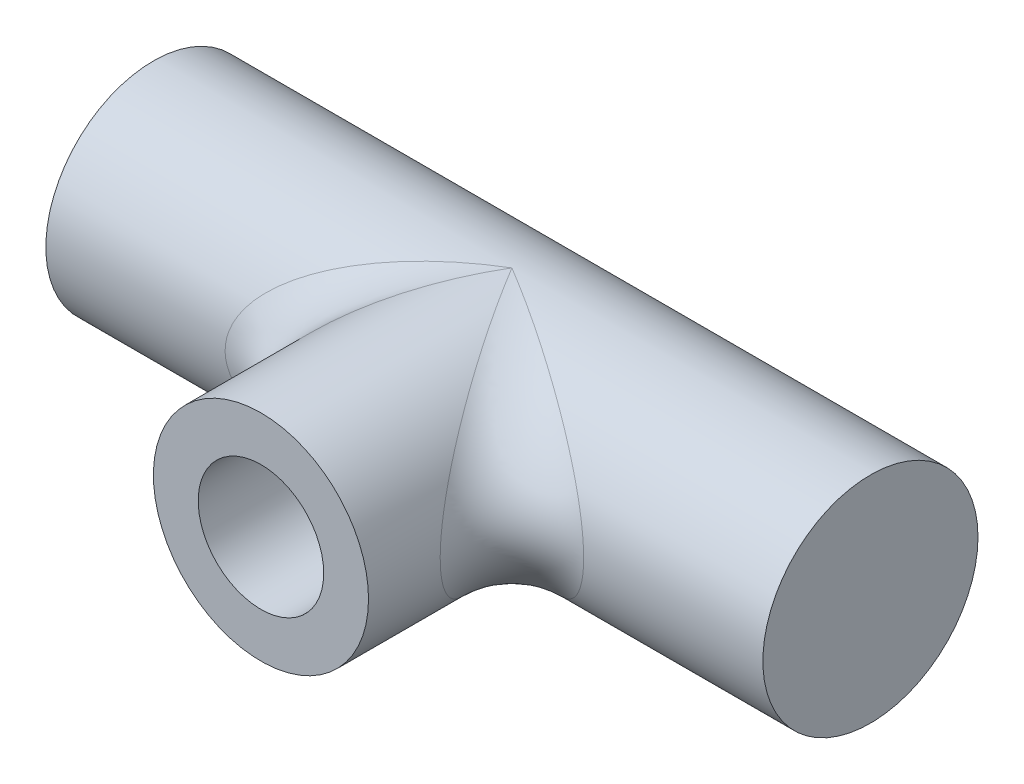
ISO-10303-21;
HEADER;
FILE_DESCRIPTION(('STEP AP214'),'2;1');
FILE_NAME('part.step','',(''),(''),'','','');
FILE_SCHEMA(('AUTOMOTIVE_DESIGN { 1 0 10303 214 1 1 1 1 }'));
ENDSEC;
DATA;
#1=APPLICATION_CONTEXT('core data for automotive mechanical design processes');
#2=APPLICATION_PROTOCOL_DEFINITION('international standard','automotive_design',2000,#1);
#3=PRODUCT_CONTEXT('',#1,'mechanical');
#4=PRODUCT('Part','Part','',(#3));
#5=PRODUCT_RELATED_PRODUCT_CATEGORY('part','',(#4));
#6=PRODUCT_DEFINITION_FORMATION('','',#4);
#7=PRODUCT_DEFINITION_CONTEXT('part definition',#1,'design');
#8=PRODUCT_DEFINITION('design','',#6,#7);
#9=PRODUCT_DEFINITION_SHAPE('','',#8);
#10=(LENGTH_UNIT() NAMED_UNIT(*) SI_UNIT(.MILLI.,.METRE.));
#11=(NAMED_UNIT(*) PLANE_ANGLE_UNIT() SI_UNIT($,.RADIAN.));
#12=(NAMED_UNIT(*) SI_UNIT($,.STERADIAN.) SOLID_ANGLE_UNIT());
#13=UNCERTAINTY_MEASURE_WITH_UNIT(LENGTH_MEASURE(1.E-05),#10,'distance_accuracy_value','');
#14=(GEOMETRIC_REPRESENTATION_CONTEXT(3) GLOBAL_UNCERTAINTY_ASSIGNED_CONTEXT((#13)) GLOBAL_UNIT_ASSIGNED_CONTEXT((#10,
#11,#12)) REPRESENTATION_CONTEXT('',''));
#15=CARTESIAN_POINT('',(0.,0.,0.));
#16=DIRECTION('',(0.,0.,1.));
#17=DIRECTION('',(1.,0.,0.));
#18=AXIS2_PLACEMENT_3D('',#15,#16,#17);
#19=CARTESIAN_POINT('',(25.4,0.,0.));
#20=DIRECTION('',(-1.,0.,0.));
#21=DIRECTION('',(0.,0.,1.));
#22=AXIS2_PLACEMENT_3D('',#19,#20,#21);
#23=CYLINDRICAL_SURFACE('',#22,3.81);
#24=CARTESIAN_POINT('',(0.,0.,0.));
#25=DIRECTION('',(1.,0.,0.));
#26=DIRECTION('',(0.,0.,-1.));
#27=AXIS2_PLACEMENT_3D('',#24,#25,#26);
#28=CIRCLE('',#27,3.81);
#29=CARTESIAN_POINT('',(0.,0.,-3.81));
#30=VERTEX_POINT('',#29);
#31=EDGE_CURVE('E99',#30,#30,#28,.T.);
#32=ORIENTED_EDGE('',*,*,#31,.T.);
#33=EDGE_LOOP('',(#32));
#34=FACE_BOUND('',#33,.T.);
#35=CARTESIAN_POINT('',(25.4,0.,0.));
#36=DIRECTION('',(1.,0.,0.));
#37=DIRECTION('',(0.,0.,-1.));
#38=AXIS2_PLACEMENT_3D('',#35,#36,#37);
#39=CIRCLE('',#38,3.81);
#40=CARTESIAN_POINT('',(25.4,0.,-3.81));
#41=VERTEX_POINT('',#40);
#42=EDGE_CURVE('E64',#41,#41,#39,.T.);
#43=ORIENTED_EDGE('',*,*,#42,.F.);
#44=EDGE_LOOP('',(#43));
#45=FACE_BOUND('',#44,.T.);
#46=CARTESIAN_POINT('',(12.7,0.,0.));
#47=DIRECTION('',(-0.514495755427526,0.,0.857492925712544));
#48=DIRECTION('',(-0.857492925712544,0.,-0.514495755427527));
#49=AXIS2_PLACEMENT_3D('',#46,#47,#48);
#50=ELLIPSE('',#49,7.40530890645353,3.81);
#51=CARTESIAN_POINT('',(12.7,3.81,0.));
#52=VERTEX_POINT('',#51);
#53=CARTESIAN_POINT('',(12.7,-3.81,0.));
#54=VERTEX_POINT('',#53);
#55=EDGE_CURVE('E46',#52,#54,#50,.F.);
#56=ORIENTED_EDGE('',*,*,#55,.T.);
#57=CARTESIAN_POINT('',(12.7,0.,0.));
#58=DIRECTION('',(0.514495755427526,0.,0.857492925712544));
#59=DIRECTION('',(0.857492925712544,0.,-0.514495755427527));
#60=AXIS2_PLACEMENT_3D('',#57,#58,#59);
#61=ELLIPSE('',#60,7.40530890645353,3.81);
#62=EDGE_CURVE('E11',#54,#52,#61,.F.);
#63=ORIENTED_EDGE('',*,*,#62,.T.);
#64=EDGE_LOOP('',(#56,#63));
#65=FACE_BOUND('',#64,.T.);
#66=ADVANCED_FACE('F33',(#34,#45,#65),#23,.T.);
#67=CARTESIAN_POINT('',(25.4,0.,0.));
#68=DIRECTION('',(1.,0.,0.));
#69=DIRECTION('',(0.,0.,-1.));
#70=AXIS2_PLACEMENT_3D('',#67,#68,#69);
#71=PLANE('',#70);
#72=ORIENTED_EDGE('',*,*,#42,.T.);
#73=EDGE_LOOP('',(#72));
#74=FACE_BOUND('',#73,.T.);
#75=ADVANCED_FACE('F84',(#74),#71,.T.);
#76=CARTESIAN_POINT('',(0.,0.,0.));
#77=DIRECTION('',(1.,0.,0.));
#78=DIRECTION('',(0.,0.,-1.));
#79=AXIS2_PLACEMENT_3D('',#76,#77,#78);
#80=PLANE('',#79);
#81=ORIENTED_EDGE('',*,*,#31,.F.);
#82=EDGE_LOOP('',(#81));
#83=FACE_BOUND('',#82,.T.);
#84=ADVANCED_FACE('F81',(#83),#80,.F.);
#85=CARTESIAN_POINT('',(12.7,0.,8.89));
#86=DIRECTION('',(0.,0.,-1.));
#87=DIRECTION('',(-1.,0.,0.));
#88=AXIS2_PLACEMENT_3D('',#85,#86,#87);
#89=CYLINDRICAL_SURFACE('',#88,3.81);
#90=CARTESIAN_POINT('',(12.7,0.,8.89));
#91=DIRECTION('',(0.,0.,1.));
#92=DIRECTION('',(1.,0.,0.));
#93=AXIS2_PLACEMENT_3D('',#90,#91,#92);
#94=CIRCLE('',#93,3.81);
#95=CARTESIAN_POINT('',(16.51,0.,8.89));
#96=VERTEX_POINT('',#95);
#97=EDGE_CURVE('E103',#96,#96,#94,.T.);
#98=ORIENTED_EDGE('',*,*,#97,.F.);
#99=EDGE_LOOP('',(#98));
#100=FACE_BOUND('',#99,.T.);
#101=CARTESIAN_POINT('',(12.7,0.,0.));
#102=DIRECTION('',(-0.857492925712544,0.,0.514495755427527));
#103=DIRECTION('',(-0.514495755427527,0.,-0.857492925712544));
#104=AXIS2_PLACEMENT_3D('',#101,#102,#103);
#105=ELLIPSE('',#104,7.40530890645353,3.81);
#106=EDGE_CURVE('E57',#54,#52,#105,.T.);
#107=ORIENTED_EDGE('',*,*,#106,.T.);
#108=CARTESIAN_POINT('',(12.7,0.,0.));
#109=DIRECTION('',(0.857492925712544,0.,0.514495755427527));
#110=DIRECTION('',(0.514495755427527,0.,-0.857492925712544));
#111=AXIS2_PLACEMENT_3D('',#108,#109,#110);
#112=ELLIPSE('',#111,7.40530890645353,3.81);
#113=EDGE_CURVE('E60',#52,#54,#112,.T.);
#114=ORIENTED_EDGE('',*,*,#113,.T.);
#115=EDGE_LOOP('',(#107,#114));
#116=FACE_BOUND('',#115,.T.);
#117=ADVANCED_FACE('F63',(#100,#116),#89,.T.);
#118=CARTESIAN_POINT('',(12.7,0.,8.89));
#119=DIRECTION('',(0.,0.,1.));
#120=DIRECTION('',(1.,0.,0.));
#121=AXIS2_PLACEMENT_3D('',#118,#119,#120);
#122=PLANE('',#121);
#123=CARTESIAN_POINT('',(12.7,0.,8.89));
#124=DIRECTION('',(0.,0.,1.));
#125=DIRECTION('',(1.,0.,0.));
#126=AXIS2_PLACEMENT_3D('',#123,#124,#125);
#127=CIRCLE('',#126,2.2225);
#128=CARTESIAN_POINT('',(14.9225,0.,8.89));
#129=VERTEX_POINT('',#128);
#130=EDGE_CURVE('E108',#129,#129,#127,.T.);
#131=ORIENTED_EDGE('',*,*,#130,.F.);
#132=EDGE_LOOP('',(#131));
#133=FACE_BOUND('',#132,.T.);
#134=ORIENTED_EDGE('',*,*,#97,.T.);
#135=EDGE_LOOP('',(#134));
#136=FACE_BOUND('',#135,.T.);
#137=ADVANCED_FACE('F80',(#133,#136),#122,.T.);
#138=CARTESIAN_POINT('',(12.7,0.,2.54));
#139=DIRECTION('',(0.,0.,1.));
#140=DIRECTION('',(1.,0.,0.));
#141=AXIS2_PLACEMENT_3D('',#138,#139,#140);
#142=CYLINDRICAL_SURFACE('',#141,2.2225);
#143=CARTESIAN_POINT('',(12.7,0.,2.54));
#144=DIRECTION('',(0.,0.,1.));
#145=DIRECTION('',(1.,0.,0.));
#146=AXIS2_PLACEMENT_3D('',#143,#144,#145);
#147=CIRCLE('',#146,2.2225);
#148=CARTESIAN_POINT('',(14.9225,0.,2.54));
#149=VERTEX_POINT('',#148);
#150=EDGE_CURVE('E107',#149,#149,#147,.T.);
#151=ORIENTED_EDGE('',*,*,#150,.F.);
#152=EDGE_LOOP('',(#151));
#153=FACE_BOUND('',#152,.T.);
#154=ORIENTED_EDGE('',*,*,#130,.T.);
#155=EDGE_LOOP('',(#154));
#156=FACE_BOUND('',#155,.T.);
#157=ADVANCED_FACE('F115',(#153,#156),#142,.F.);
#158=CARTESIAN_POINT('',(12.7,0.,2.54));
#159=DIRECTION('',(0.,0.,1.));
#160=DIRECTION('',(1.,0.,0.));
#161=AXIS2_PLACEMENT_3D('',#158,#159,#160);
#162=PLANE('',#161);
#163=ORIENTED_EDGE('',*,*,#150,.T.);
#164=EDGE_LOOP('',(#163));
#165=FACE_BOUND('',#164,.T.);
#166=ADVANCED_FACE('F73',(#165),#162,.T.);
#167=CARTESIAN_POINT('',(12.7,-3.81,0.));
#168=CARTESIAN_POINT('',(12.7,-3.81,0.));
#169=CARTESIAN_POINT('',(12.7,-3.81,0.));
#170=CARTESIAN_POINT('',(12.4233638558909,-3.80993321974872,0.165981686465461));
#171=CARTESIAN_POINT('',(12.4786464785112,-3.81036885578972,0.221353521488818));
#172=CARTESIAN_POINT('',(12.5340183135345,-3.80993321974872,0.276636144109101));
#173=CARTESIAN_POINT('',(12.1466570770282,-3.79914819144426,0.332005753783057));
#174=CARTESIAN_POINT('',(12.2566846568416,-3.79190779704979,0.443315343158407));
#175=CARTESIAN_POINT('',(12.3679942462169,-3.79914819144426,0.553342922971761));
#176=CARTESIAN_POINT('',(11.5980019885052,-3.75584646767565,0.661198806896862));
#177=CARTESIAN_POINT('',(11.8206381992682,-3.71973214948432,0.879361800731836));
#178=CARTESIAN_POINT('',(12.0388011931031,-3.75584646767565,1.10199801149477));
#179=CARTESIAN_POINT('',(11.3260332239273,-3.72351526824196,0.824380065643621));
#180=CARTESIAN_POINT('',(11.6052979347828,-3.66591361951389,1.09470206521722));
#181=CARTESIAN_POINT('',(11.8756199343564,-3.72351526824196,1.3739667760727));
#182=CARTESIAN_POINT('',(10.7914857874565,-3.63756643220027,1.1451085275261));
#183=CARTESIAN_POINT('',(11.1890571275766,-3.52479392702254,1.51094287242344));
#184=CARTESIAN_POINT('',(11.5548914724739,-3.63756643220027,1.9085142125435));
#185=CARTESIAN_POINT('',(10.5288261294835,-3.58431492783376,1.3027043223099));
#186=CARTESIAN_POINT('',(10.9869165791871,-3.43728807810987,1.71308342081288));
#187=CARTESIAN_POINT('',(11.3972956776901,-3.58431492783376,2.17117387051649));
#188=CARTESIAN_POINT('',(10.0174712846346,-3.45723193675458,1.60951722921927));
#189=CARTESIAN_POINT('',(10.6034122752458,-3.23271318316638,2.09658772475415));
#190=CARTESIAN_POINT('',(11.0904827707807,-3.45723193675458,2.68252871536545));
#191=CARTESIAN_POINT('',(9.76859148737374,-3.38393974128717,1.75884510757576));
#192=CARTESIAN_POINT('',(10.4208489417535,-3.11533998330299,2.27915105824645));
#193=CARTESIAN_POINT('',(10.9411548924242,-3.38393974128717,2.93140851262626));
#194=CARTESIAN_POINT('',(9.28916204559132,-3.21785975045561,2.04650277264521));
#195=CARTESIAN_POINT('',(10.0824035307089,-2.85668051638589,2.61759646929115));
#196=CARTESIAN_POINT('',(10.6534972273548,-3.21785975045561,3.41083795440868));
#197=CARTESIAN_POINT('',(9.05828110443832,-3.12576675752266,2.18503133733701));
#198=CARTESIAN_POINT('',(9.92539363506397,-2.71500532021528,2.77460636493603));
#199=CARTESIAN_POINT('',(10.514968662663,-3.12576675752266,3.64171889556168));
#200=CARTESIAN_POINT('',(8.61895611330127,-2.92350246872515,2.44862633201924));
#201=CARTESIAN_POINT('',(9.64308738920124,-2.41564582114178,3.05691261079876));
#202=CARTESIAN_POINT('',(10.2513736679808,-2.92350246872515,4.08104388669873));
#203=CARTESIAN_POINT('',(8.40999288517722,-2.81415096841822,2.57400426889367));
#204=CARTESIAN_POINT('',(9.51677867273304,-2.25752036214398,3.18322132726696));
#205=CARTESIAN_POINT('',(10.1259957311063,-2.81415096841822,4.29000711482278));
#206=CARTESIAN_POINT('',(8.01827657025085,-2.57911811677988,2.80903405784949));
#207=CARTESIAN_POINT('',(9.29927295837897,-1.93559368355987,3.40072704162103));
#208=CARTESIAN_POINT('',(9.89096594215051,-2.57911811677988,4.68172342974915));
#209=CARTESIAN_POINT('',(7.83478613171726,-2.45433091819614,2.91912832096964));
#210=CARTESIAN_POINT('',(9.20722772774892,-1.77135942974781,3.49277227225108));
#211=CARTESIAN_POINT('',(9.78087167903036,-2.45433091819614,4.86521386828274));
#212=CARTESIAN_POINT('',(7.49738357434681,-2.19049690480905,3.12156985539191));
#213=CARTESIAN_POINT('',(9.0588256763292,-1.44969652945083,3.6411743236708));
#214=CARTESIAN_POINT('',(9.57843014460809,-2.19049690480905,5.20261642565318));
#215=CARTESIAN_POINT('',(7.34251267841294,-2.05234314297451,3.21449239295224));
#216=CARTESIAN_POINT('',(9.00182493457642,-1.29193162235325,3.69817506542358));
#217=CARTESIAN_POINT('',(9.48550760704776,-2.05234314297451,5.35748732158706));
#218=CARTESIAN_POINT('',(7.06522601790001,-1.76416413806299,3.38086438925999));
#219=CARTESIAN_POINT('',(8.91979178411322,-0.99627447899692,3.78020821588678));
#220=CARTESIAN_POINT('',(9.31913561074001,-1.76416413806299,5.63477398209999));
#221=CARTESIAN_POINT('',(6.94167897186276,-1.61493265333538,3.45499261688235));
#222=CARTESIAN_POINT('',(8.89433190286196,-0.858243165481755,3.80566809713804));
#223=CARTESIAN_POINT('',(9.24500738311765,-1.61493265333538,5.75832102813724));
#224=CARTESIAN_POINT('',(6.72931557515179,-1.30729301642614,3.58241065490892));
#225=CARTESIAN_POINT('',(8.86636977231452,-0.612060379146636,3.83363022768548));
#226=CARTESIAN_POINT('',(9.11758934509108,-1.30729301642614,5.9706844248482));
#227=CARTESIAN_POINT('',(6.63932330815343,-1.14947751354814,3.63640601510794));
#228=CARTESIAN_POINT('',(8.86362721544481,-0.504039166358602,3.83637278455519));
#229=CARTESIAN_POINT('',(9.06359398489206,-1.14947751354814,6.06067669184657));
#230=CARTESIAN_POINT('',(6.49560919921343,-0.827629245596447,3.72263448047194));
#231=CARTESIAN_POINT('',(8.86793262657402,-0.319375882495125,3.83206737342598));
#232=CARTESIAN_POINT('',(8.97736551952806,-0.827629245596447,6.20439080078657));
#233=CARTESIAN_POINT('',(6.44087942003191,-0.663925447888567,3.75547234798086));
#234=CARTESIAN_POINT('',(8.87486727851083,-0.24313209842635,3.82513272148917));
#235=CARTESIAN_POINT('',(8.94452765201914,-0.663925447888567,6.25912057996809));
#236=CARTESIAN_POINT('',(6.36837057227089,-0.333417815912856,3.79897765663747));
#237=CARTESIAN_POINT('',(8.88592240277298,-0.110977469001204,3.81407759722702));
#238=CARTESIAN_POINT('',(8.90102234336253,-0.333417815912856,6.33162942772911));
#239=CARTESIAN_POINT('',(6.35,-0.166708907956428,3.81));
#240=CARTESIAN_POINT('',(8.89,-0.0556506559387448,3.81));
#241=CARTESIAN_POINT('',(8.89,-0.166708907956428,6.35));
#242=CARTESIAN_POINT('',(6.35,0.166708907956427,3.81));
#243=CARTESIAN_POINT('',(8.89,0.0556506559387445,3.81));
#244=CARTESIAN_POINT('',(8.89,0.166708907956427,6.35));
#245=CARTESIAN_POINT('',(6.36837057227089,0.333417815912855,3.79897765663747));
#246=CARTESIAN_POINT('',(8.88592240277298,0.110977469001203,3.81407759722702));
#247=CARTESIAN_POINT('',(8.90102234336253,0.333417815912855,6.33162942772911));
#248=CARTESIAN_POINT('',(6.44087942003191,0.663925447888566,3.75547234798086));
#249=CARTESIAN_POINT('',(8.87486727851083,0.24313209842635,3.82513272148917));
#250=CARTESIAN_POINT('',(8.94452765201914,0.663925447888566,6.25912057996809));
#251=CARTESIAN_POINT('',(6.49560919921343,0.827629245596446,3.72263448047194));
#252=CARTESIAN_POINT('',(8.86793262657402,0.319375882495125,3.83206737342598));
#253=CARTESIAN_POINT('',(8.97736551952806,0.827629245596446,6.20439080078657));
#254=CARTESIAN_POINT('',(6.63932330815343,1.14947751354814,3.63640601510794));
#255=CARTESIAN_POINT('',(8.86362721544481,0.504039166358601,3.83637278455519));
#256=CARTESIAN_POINT('',(9.06359398489206,1.14947751354814,6.06067669184657));
#257=CARTESIAN_POINT('',(6.7293155751518,1.30729301642613,3.58241065490892));
#258=CARTESIAN_POINT('',(8.86636977231452,0.612060379146635,3.83363022768548));
#259=CARTESIAN_POINT('',(9.11758934509108,1.30729301642613,5.9706844248482));
#260=CARTESIAN_POINT('',(6.94167897186276,1.61493265333538,3.45499261688235));
#261=CARTESIAN_POINT('',(8.89433190286196,0.858243165481754,3.80566809713804));
#262=CARTESIAN_POINT('',(9.24500738311765,1.61493265333538,5.75832102813724));
#263=CARTESIAN_POINT('',(7.06522601790001,1.76416413806299,3.38086438926));
#264=CARTESIAN_POINT('',(8.91979178411321,0.99627447899692,3.78020821588678));
#265=CARTESIAN_POINT('',(9.31913561074,1.76416413806299,5.63477398209999));
#266=CARTESIAN_POINT('',(7.34251267841294,2.05234314297451,3.21449239295224));
#267=CARTESIAN_POINT('',(9.00182493457642,1.29193162235325,3.69817506542358));
#268=CARTESIAN_POINT('',(9.48550760704776,2.05234314297451,5.35748732158706));
#269=CARTESIAN_POINT('',(7.49738357434681,2.19049690480905,3.12156985539191));
#270=CARTESIAN_POINT('',(9.0588256763292,1.44969652945083,3.6411743236708));
#271=CARTESIAN_POINT('',(9.57843014460809,2.19049690480905,5.20261642565319));
#272=CARTESIAN_POINT('',(7.83478613171726,2.45433091819614,2.91912832096964));
#273=CARTESIAN_POINT('',(9.20722772774891,1.77135942974781,3.49277227225108));
#274=CARTESIAN_POINT('',(9.78087167903035,2.45433091819614,4.86521386828274));
#275=CARTESIAN_POINT('',(8.01827657025084,2.57911811677988,2.80903405784949));
#276=CARTESIAN_POINT('',(9.29927295837897,1.93559368355986,3.40072704162103));
#277=CARTESIAN_POINT('',(9.89096594215051,2.57911811677988,4.68172342974916));
#278=CARTESIAN_POINT('',(8.40999288517721,2.81415096841821,2.57400426889367));
#279=CARTESIAN_POINT('',(9.51677867273304,2.25752036214398,3.18322132726696));
#280=CARTESIAN_POINT('',(10.1259957311063,2.81415096841822,4.29000711482279));
#281=CARTESIAN_POINT('',(8.61895611330127,2.92350246872515,2.44862633201924));
#282=CARTESIAN_POINT('',(9.64308738920124,2.41564582114178,3.05691261079876));
#283=CARTESIAN_POINT('',(10.2513736679808,2.92350246872515,4.08104388669873));
#284=CARTESIAN_POINT('',(9.05828110443832,3.12576675752265,2.18503133733701));
#285=CARTESIAN_POINT('',(9.92539363506397,2.71500532021527,2.77460636493603));
#286=CARTESIAN_POINT('',(10.514968662663,3.12576675752265,3.64171889556168));
#287=CARTESIAN_POINT('',(9.28916204559131,3.21785975045561,2.04650277264521));
#288=CARTESIAN_POINT('',(10.0824035307089,2.85668051638589,2.61759646929115));
#289=CARTESIAN_POINT('',(10.6534972273548,3.21785975045561,3.41083795440868));
#290=CARTESIAN_POINT('',(9.76859148737374,3.38393974128717,1.75884510757576));
#291=CARTESIAN_POINT('',(10.4208489417535,3.11533998330299,2.27915105824645));
#292=CARTESIAN_POINT('',(10.9411548924242,3.38393974128717,2.93140851262626));
#293=CARTESIAN_POINT('',(10.0174712846345,3.45723193675458,1.60951722921927));
#294=CARTESIAN_POINT('',(10.6034122752458,3.23271318316638,2.09658772475416));
#295=CARTESIAN_POINT('',(11.0904827707807,3.45723193675458,2.68252871536545));
#296=CARTESIAN_POINT('',(10.5288261294835,3.58431492783376,1.3027043223099));
#297=CARTESIAN_POINT('',(10.9869165791871,3.43728807810987,1.71308342081288));
#298=CARTESIAN_POINT('',(11.3972956776901,3.58431492783376,2.17117387051649));
#299=CARTESIAN_POINT('',(10.7914857874565,3.63756643220027,1.1451085275261));
#300=CARTESIAN_POINT('',(11.1890571275766,3.52479392702254,1.51094287242344));
#301=CARTESIAN_POINT('',(11.5548914724739,3.63756643220027,1.9085142125435));
#302=CARTESIAN_POINT('',(11.3260332239273,3.72351526824196,0.824380065643621));
#303=CARTESIAN_POINT('',(11.6052979347828,3.66591361951389,1.09470206521722));
#304=CARTESIAN_POINT('',(11.8756199343564,3.72351526824196,1.3739667760727));
#305=CARTESIAN_POINT('',(11.5980019885052,3.75584646767565,0.661198806896862));
#306=CARTESIAN_POINT('',(11.8206381992682,3.71973214948432,0.879361800731836));
#307=CARTESIAN_POINT('',(12.0388011931031,3.75584646767565,1.10199801149477));
#308=CARTESIAN_POINT('',(12.1466570770282,3.79914819144426,0.332005753783057));
#309=CARTESIAN_POINT('',(12.2566846568416,3.79190779704979,0.443315343158407));
#310=CARTESIAN_POINT('',(12.3679942462169,3.79914819144426,0.553342922971762));
#311=CARTESIAN_POINT('',(12.4233638558909,3.80993321974872,0.165981686465462));
#312=CARTESIAN_POINT('',(12.4786464785112,3.81036885578972,0.221353521488818));
#313=CARTESIAN_POINT('',(12.5340183135345,3.80993321974872,0.276636144109103));
#314=CARTESIAN_POINT('',(12.7,3.81,0.));
#315=CARTESIAN_POINT('',(12.7,3.81,0.));
#316=CARTESIAN_POINT('',(12.7,3.81,0.));
#317=(BOUNDED_SURFACE() B_SPLINE_SURFACE(3,2,((#167,#168,#169),(#170,#171,#172),(#173,#174,
#175),(#176,#177,#178),(#179,#180,#181),(#182,#183,#184),(#185,#186,#187),(#188,#189,#190),
(#191,#192,#193),(#194,#195,#196),(#197,#198,#199),(#200,#201,#202),(#203,#204,#205),(#206,#207,
#208),(#209,#210,#211),(#212,#213,#214),(#215,#216,#217),(#218,#219,#220),(#221,#222,#223),
(#224,#225,#226),(#227,#228,#229),(#230,#231,#232),(#233,#234,#235),(#236,#237,#238),(#239,#240,
#241),(#242,#243,#244),(#245,#246,#247),(#248,#249,#250),(#251,#252,#253),(#254,#255,#256),
(#257,#258,#259),(#260,#261,#262),(#263,#264,#265),(#266,#267,#268),(#269,#270,#271),(#272,#273,
#274),(#275,#276,#277),(#278,#279,#280),(#281,#282,#283),(#284,#285,#286),(#287,#288,#289),
(#290,#291,#292),(#293,#294,#295),(#296,#297,#298),(#299,#300,#301),(#302,#303,#304),(#305,#306,
#307),(#308,#309,#310),(#311,#312,#313),(#314,#315,#316)),.UNSPECIFIED.,.F.,.F.,
.F.) B_SPLINE_SURFACE_WITH_KNOTS((4,2,2,2,2,2,2,2,2,2,2,2,2,2,2,2,2,2,2,2,2,2,2,2,4),(3,3),(0.,
1.17341684376805,2.33685977065809,3.48078832236515,4.59653688757617,5.67677110302749,
6.71596340692674,7.71088391583373,8.66108468582682,9.56932066989524,10.4417969917038,
11.2880759169977,12.1204702792375,12.9528646414773,13.7991435667713,14.6716198885798,
15.5798558726483,16.5300566426414,17.5249771515483,18.5641694554476,19.6444036708989,
20.7601522361099,21.904080787817,23.067523714707,24.2409405584751),(0.,1.),
.UNSPECIFIED.) GEOMETRIC_REPRESENTATION_ITEM() RATIONAL_B_SPLINE_SURFACE(((1.,1.,1.),(1.,
1.00000566557019,1.),(1.,0.998576699090688,1.),(1.,0.992910721279765,1.),(1.,0.988697681267574,
1.),(1.,0.97761712883305,1.),(1.,0.970795325018433,1.),(1.,0.954789124900482,1.),(1.,
0.945667069465631,1.),(1.,0.92548796875733,1.),(1.,0.914501756375306,1.),(1.,0.891169998194024,
1.),(1.,0.878891956959708,1.),(1.,0.853706993048538,1.),(1.,0.84084914596985,1.),(1.,
0.815387454422431,1.),(1.,0.802798170091792,1.),(1.,0.778880732263429,1.),(1.,0.767521437046521,
1.),(1.,0.747118526989836,1.),(1.,0.738001346912332,1.),(1.,0.723039691293395,1.),(1.,
0.717105167896984,1.),(1.,0.709170186451793,1.),(1.,0.707106781186548,1.),(1.,0.707106781186548,
1.),(1.,0.709170186451793,1.),(1.,0.717105167896984,1.),(1.,0.723039691293395,1.),(1.,
0.738001346912332,1.),(1.,0.747118526989836,1.),(1.,0.767521437046521,1.),(1.,0.778880732263429,
1.),(1.,0.802798170091792,1.),(1.,0.815387454422431,1.),(1.,0.84084914596985,1.),(1.,
0.853706993048538,1.),(1.,0.878891956959708,1.),(1.,0.891169998194024,1.),(1.,0.914501756375306,
1.),(1.,0.925487968757329,1.),(1.,0.945667069465631,1.),(1.,0.954789124900482,1.),(1.,
0.970795325018433,1.),(1.,0.97761712883305,1.),(1.,0.988697681267574,1.),(1.,0.992910721279765,
1.),(1.,0.998576699090688,1.),(1.,1.00000566557019,1.),(1.,1.,1.))) REPRESENTATION_ITEM('') SURFACE());
#318=ORIENTED_EDGE('',*,*,#113,.F.);
#319=ORIENTED_EDGE('',*,*,#62,.F.);
#320=EDGE_LOOP('',(#318,#319));
#321=FACE_BOUND('',#320,.T.);
#322=ADVANCED_FACE('F66',(#321),#317,.F.);
#323=CARTESIAN_POINT('',(12.7,3.81,0.));
#324=CARTESIAN_POINT('',(12.7,3.81,0.));
#325=CARTESIAN_POINT('',(12.7,3.81,0.));
#326=CARTESIAN_POINT('',(12.9766361441091,3.80993321974872,0.165981686465461));
#327=CARTESIAN_POINT('',(12.9213535214888,3.81036885578972,0.221353521488818));
#328=CARTESIAN_POINT('',(12.8659816864655,3.80993321974872,0.276636144109101));
#329=CARTESIAN_POINT('',(13.2533429229718,3.79914819144426,0.332005753783057));
#330=CARTESIAN_POINT('',(13.1433153431584,3.79190779704979,0.443315343158407));
#331=CARTESIAN_POINT('',(13.0320057537831,3.79914819144426,0.553342922971761));
#332=CARTESIAN_POINT('',(13.8019980114948,3.75584646767565,0.661198806896862));
#333=CARTESIAN_POINT('',(13.5793618007318,3.71973214948432,0.879361800731836));
#334=CARTESIAN_POINT('',(13.3611988068969,3.75584646767565,1.10199801149477));
#335=CARTESIAN_POINT('',(14.0739667760727,3.72351526824196,0.824380065643621));
#336=CARTESIAN_POINT('',(13.7947020652172,3.66591361951389,1.09470206521722));
#337=CARTESIAN_POINT('',(13.5243800656436,3.72351526824196,1.3739667760727));
#338=CARTESIAN_POINT('',(14.6085142125435,3.63756643220027,1.1451085275261));
#339=CARTESIAN_POINT('',(14.2109428724234,3.52479392702254,1.51094287242344));
#340=CARTESIAN_POINT('',(13.8451085275261,3.63756643220027,1.9085142125435));
#341=CARTESIAN_POINT('',(14.8711738705165,3.58431492783376,1.3027043223099));
#342=CARTESIAN_POINT('',(14.4130834208129,3.43728807810987,1.71308342081288));
#343=CARTESIAN_POINT('',(14.0027043223099,3.58431492783376,2.17117387051649));
#344=CARTESIAN_POINT('',(15.3825287153654,3.45723193675458,1.60951722921927));
#345=CARTESIAN_POINT('',(14.7965877247542,3.23271318316638,2.09658772475415));
#346=CARTESIAN_POINT('',(14.3095172292193,3.45723193675458,2.68252871536545));
#347=CARTESIAN_POINT('',(15.6314085126263,3.38393974128717,1.75884510757576));
#348=CARTESIAN_POINT('',(14.9791510582465,3.11533998330299,2.27915105824645));
#349=CARTESIAN_POINT('',(14.4588451075758,3.38393974128717,2.93140851262626));
#350=CARTESIAN_POINT('',(16.1108379544087,3.21785975045561,2.04650277264521));
#351=CARTESIAN_POINT('',(15.3175964692911,2.85668051638589,2.61759646929115));
#352=CARTESIAN_POINT('',(14.7465027726452,3.21785975045561,3.41083795440868));
#353=CARTESIAN_POINT('',(16.3417188955617,3.12576675752266,2.18503133733701));
#354=CARTESIAN_POINT('',(15.474606364936,2.71500532021528,2.77460636493603));
#355=CARTESIAN_POINT('',(14.885031337337,3.12576675752266,3.64171889556168));
#356=CARTESIAN_POINT('',(16.7810438866987,2.92350246872515,2.44862633201924));
#357=CARTESIAN_POINT('',(15.7569126107988,2.41564582114178,3.05691261079876));
#358=CARTESIAN_POINT('',(15.1486263320192,2.92350246872515,4.08104388669873));
#359=CARTESIAN_POINT('',(16.9900071148228,2.81415096841822,2.57400426889367));
#360=CARTESIAN_POINT('',(15.883221327267,2.25752036214398,3.18322132726696));
#361=CARTESIAN_POINT('',(15.2740042688937,2.81415096841822,4.29000711482278));
#362=CARTESIAN_POINT('',(17.3817234297492,2.57911811677988,2.80903405784949));
#363=CARTESIAN_POINT('',(16.100727041621,1.93559368355987,3.40072704162102));
#364=CARTESIAN_POINT('',(15.5090340578495,2.57911811677988,4.68172342974915));
#365=CARTESIAN_POINT('',(17.5652138682827,2.45433091819614,2.91912832096964));
#366=CARTESIAN_POINT('',(16.1927722722511,1.77135942974781,3.49277227225108));
#367=CARTESIAN_POINT('',(15.6191283209696,2.45433091819614,4.86521386828274));
#368=CARTESIAN_POINT('',(17.9026164256532,2.19049690480905,3.12156985539191));
#369=CARTESIAN_POINT('',(16.3411743236708,1.44969652945083,3.6411743236708));
#370=CARTESIAN_POINT('',(15.8215698553919,2.19049690480905,5.20261642565319));
#371=CARTESIAN_POINT('',(18.0574873215871,2.05234314297451,3.21449239295224));
#372=CARTESIAN_POINT('',(16.3981750654236,1.29193162235325,3.69817506542358));
#373=CARTESIAN_POINT('',(15.9144923929522,2.05234314297451,5.35748732158706));
#374=CARTESIAN_POINT('',(18.3347739821,1.76416413806299,3.38086438925999));
#375=CARTESIAN_POINT('',(16.4802082158868,0.99627447899692,3.78020821588678));
#376=CARTESIAN_POINT('',(16.08086438926,1.76416413806299,5.63477398209999));
#377=CARTESIAN_POINT('',(18.4583210281372,1.61493265333538,3.45499261688235));
#378=CARTESIAN_POINT('',(16.505668097138,0.858243165481755,3.80566809713804));
#379=CARTESIAN_POINT('',(16.1549926168823,1.61493265333538,5.75832102813724));
#380=CARTESIAN_POINT('',(18.6706844248482,1.30729301642614,3.58241065490892));
#381=CARTESIAN_POINT('',(16.5336302276855,0.612060379146636,3.83363022768548));
#382=CARTESIAN_POINT('',(16.2824106549089,1.30729301642614,5.9706844248482));
#383=CARTESIAN_POINT('',(18.7606766918466,1.14947751354814,3.63640601510794));
#384=CARTESIAN_POINT('',(16.5363727845552,0.504039166358602,3.83637278455519));
#385=CARTESIAN_POINT('',(16.3364060151079,1.14947751354814,6.06067669184657));
#386=CARTESIAN_POINT('',(18.9043908007866,0.827629245596447,3.72263448047194));
#387=CARTESIAN_POINT('',(16.532067373426,0.319375882495125,3.83206737342598));
#388=CARTESIAN_POINT('',(16.4226344804719,0.827629245596447,6.20439080078657));
#389=CARTESIAN_POINT('',(18.9591205799681,0.663925447888567,3.75547234798086));
#390=CARTESIAN_POINT('',(16.5251327214892,0.24313209842635,3.82513272148917));
#391=CARTESIAN_POINT('',(16.4554723479809,0.663925447888567,6.25912057996809));
#392=CARTESIAN_POINT('',(19.0316294277291,0.333417815912856,3.79897765663747));
#393=CARTESIAN_POINT('',(16.514077597227,0.110977469001204,3.81407759722702));
#394=CARTESIAN_POINT('',(16.4989776566375,0.333417815912856,6.33162942772911));
#395=CARTESIAN_POINT('',(19.05,0.166708907956428,3.81));
#396=CARTESIAN_POINT('',(16.51,0.0556506559387449,3.81));
#397=CARTESIAN_POINT('',(16.51,0.166708907956428,6.35));
#398=CARTESIAN_POINT('',(19.05,-0.166708907956427,3.81));
#399=CARTESIAN_POINT('',(16.51,-0.0556506559387445,3.81));
#400=CARTESIAN_POINT('',(16.51,-0.166708907956427,6.35));
#401=CARTESIAN_POINT('',(19.0316294277291,-0.333417815912855,3.79897765663747));
#402=CARTESIAN_POINT('',(16.514077597227,-0.110977469001203,3.81407759722702));
#403=CARTESIAN_POINT('',(16.4989776566375,-0.333417815912855,6.33162942772911));
#404=CARTESIAN_POINT('',(18.9591205799681,-0.663925447888566,3.75547234798086));
#405=CARTESIAN_POINT('',(16.5251327214892,-0.24313209842635,3.82513272148917));
#406=CARTESIAN_POINT('',(16.4554723479809,-0.663925447888566,6.25912057996809));
#407=CARTESIAN_POINT('',(18.9043908007866,-0.827629245596446,3.72263448047194));
#408=CARTESIAN_POINT('',(16.532067373426,-0.319375882495125,3.83206737342598));
#409=CARTESIAN_POINT('',(16.4226344804719,-0.827629245596446,6.20439080078657));
#410=CARTESIAN_POINT('',(18.7606766918466,-1.14947751354814,3.63640601510794));
#411=CARTESIAN_POINT('',(16.5363727845552,-0.504039166358601,3.83637278455519));
#412=CARTESIAN_POINT('',(16.3364060151079,-1.14947751354814,6.06067669184657));
#413=CARTESIAN_POINT('',(18.6706844248482,-1.30729301642613,3.58241065490892));
#414=CARTESIAN_POINT('',(16.5336302276855,-0.612060379146635,3.83363022768548));
#415=CARTESIAN_POINT('',(16.2824106549089,-1.30729301642613,5.9706844248482));
#416=CARTESIAN_POINT('',(18.4583210281372,-1.61493265333538,3.45499261688235));
#417=CARTESIAN_POINT('',(16.505668097138,-0.858243165481754,3.80566809713804));
#418=CARTESIAN_POINT('',(16.1549926168823,-1.61493265333538,5.75832102813724));
#419=CARTESIAN_POINT('',(18.3347739821,-1.76416413806299,3.38086438926));
#420=CARTESIAN_POINT('',(16.4802082158868,-0.99627447899692,3.78020821588678));
#421=CARTESIAN_POINT('',(16.08086438926,-1.76416413806299,5.63477398209999));
#422=CARTESIAN_POINT('',(18.0574873215871,-2.05234314297451,3.21449239295224));
#423=CARTESIAN_POINT('',(16.3981750654236,-1.29193162235325,3.69817506542358));
#424=CARTESIAN_POINT('',(15.9144923929522,-2.05234314297451,5.35748732158706));
#425=CARTESIAN_POINT('',(17.9026164256532,-2.19049690480905,3.12156985539191));
#426=CARTESIAN_POINT('',(16.3411743236708,-1.44969652945083,3.6411743236708));
#427=CARTESIAN_POINT('',(15.8215698553919,-2.19049690480905,5.20261642565319));
#428=CARTESIAN_POINT('',(17.5652138682827,-2.45433091819614,2.91912832096964));
#429=CARTESIAN_POINT('',(16.1927722722511,-1.77135942974781,3.49277227225108));
#430=CARTESIAN_POINT('',(15.6191283209696,-2.45433091819614,4.86521386828274));
#431=CARTESIAN_POINT('',(17.3817234297492,-2.57911811677988,2.80903405784949));
#432=CARTESIAN_POINT('',(16.100727041621,-1.93559368355986,3.40072704162103));
#433=CARTESIAN_POINT('',(15.5090340578495,-2.57911811677988,4.68172342974916));
#434=CARTESIAN_POINT('',(16.9900071148228,-2.81415096841821,2.57400426889367));
#435=CARTESIAN_POINT('',(15.883221327267,-2.25752036214398,3.18322132726696));
#436=CARTESIAN_POINT('',(15.2740042688937,-2.81415096841822,4.29000711482279));
#437=CARTESIAN_POINT('',(16.7810438866987,-2.92350246872515,2.44862633201924));
#438=CARTESIAN_POINT('',(15.7569126107988,-2.41564582114178,3.05691261079876));
#439=CARTESIAN_POINT('',(15.1486263320192,-2.92350246872515,4.08104388669873));
#440=CARTESIAN_POINT('',(16.3417188955617,-3.12576675752265,2.18503133733701));
#441=CARTESIAN_POINT('',(15.474606364936,-2.71500532021527,2.77460636493603));
#442=CARTESIAN_POINT('',(14.885031337337,-3.12576675752266,3.64171889556168));
#443=CARTESIAN_POINT('',(16.1108379544087,-3.21785975045561,2.04650277264521));
#444=CARTESIAN_POINT('',(15.3175964692911,-2.85668051638589,2.61759646929115));
#445=CARTESIAN_POINT('',(14.7465027726452,-3.21785975045561,3.41083795440868));
#446=CARTESIAN_POINT('',(15.6314085126263,-3.38393974128717,1.75884510757576));
#447=CARTESIAN_POINT('',(14.9791510582465,-3.11533998330299,2.27915105824645));
#448=CARTESIAN_POINT('',(14.4588451075758,-3.38393974128717,2.93140851262626));
#449=CARTESIAN_POINT('',(15.3825287153654,-3.45723193675458,1.60951722921927));
#450=CARTESIAN_POINT('',(14.7965877247542,-3.23271318316638,2.09658772475416));
#451=CARTESIAN_POINT('',(14.3095172292193,-3.45723193675458,2.68252871536545));
#452=CARTESIAN_POINT('',(14.8711738705165,-3.58431492783376,1.3027043223099));
#453=CARTESIAN_POINT('',(14.4130834208129,-3.43728807810987,1.71308342081288));
#454=CARTESIAN_POINT('',(14.0027043223099,-3.58431492783376,2.17117387051649));
#455=CARTESIAN_POINT('',(14.6085142125435,-3.63756643220027,1.1451085275261));
#456=CARTESIAN_POINT('',(14.2109428724234,-3.52479392702254,1.51094287242344));
#457=CARTESIAN_POINT('',(13.8451085275261,-3.63756643220027,1.9085142125435));
#458=CARTESIAN_POINT('',(14.0739667760727,-3.72351526824196,0.824380065643621));
#459=CARTESIAN_POINT('',(13.7947020652172,-3.66591361951389,1.09470206521722));
#460=CARTESIAN_POINT('',(13.5243800656436,-3.72351526824196,1.3739667760727));
#461=CARTESIAN_POINT('',(13.8019980114948,-3.75584646767565,0.661198806896862));
#462=CARTESIAN_POINT('',(13.5793618007318,-3.71973214948432,0.879361800731836));
#463=CARTESIAN_POINT('',(13.3611988068969,-3.75584646767565,1.10199801149477));
#464=CARTESIAN_POINT('',(13.2533429229718,-3.79914819144426,0.332005753783057));
#465=CARTESIAN_POINT('',(13.1433153431584,-3.79190779704979,0.443315343158407));
#466=CARTESIAN_POINT('',(13.0320057537831,-3.79914819144426,0.553342922971762));
#467=CARTESIAN_POINT('',(12.9766361441091,-3.80993321974872,0.165981686465462));
#468=CARTESIAN_POINT('',(12.9213535214888,-3.81036885578972,0.221353521488818));
#469=CARTESIAN_POINT('',(12.8659816864655,-3.80993321974872,0.276636144109103));
#470=CARTESIAN_POINT('',(12.7,-3.81,0.));
#471=CARTESIAN_POINT('',(12.7,-3.81,0.));
#472=CARTESIAN_POINT('',(12.7,-3.81,0.));
#473=(BOUNDED_SURFACE() B_SPLINE_SURFACE(3,2,((#323,#324,#325),(#326,#327,#328),(#329,#330,
#331),(#332,#333,#334),(#335,#336,#337),(#338,#339,#340),(#341,#342,#343),(#344,#345,#346),
(#347,#348,#349),(#350,#351,#352),(#353,#354,#355),(#356,#357,#358),(#359,#360,#361),(#362,#363,
#364),(#365,#366,#367),(#368,#369,#370),(#371,#372,#373),(#374,#375,#376),(#377,#378,#379),
(#380,#381,#382),(#383,#384,#385),(#386,#387,#388),(#389,#390,#391),(#392,#393,#394),(#395,#396,
#397),(#398,#399,#400),(#401,#402,#403),(#404,#405,#406),(#407,#408,#409),(#410,#411,#412),
(#413,#414,#415),(#416,#417,#418),(#419,#420,#421),(#422,#423,#424),(#425,#426,#427),(#428,#429,
#430),(#431,#432,#433),(#434,#435,#436),(#437,#438,#439),(#440,#441,#442),(#443,#444,#445),
(#446,#447,#448),(#449,#450,#451),(#452,#453,#454),(#455,#456,#457),(#458,#459,#460),(#461,#462,
#463),(#464,#465,#466),(#467,#468,#469),(#470,#471,#472)),.UNSPECIFIED.,.F.,.F.,
.F.) B_SPLINE_SURFACE_WITH_KNOTS((4,2,2,2,2,2,2,2,2,2,2,2,2,2,2,2,2,2,2,2,2,2,2,2,4),(3,3),(0.,
1.17341684376805,2.33685977065809,3.48078832236515,4.59653688757617,5.67677110302749,
6.71596340692674,7.71088391583373,8.66108468582682,9.56932066989524,10.4417969917038,
11.2880759169977,12.1204702792375,12.9528646414773,13.7991435667713,14.6716198885798,
15.5798558726483,16.5300566426414,17.5249771515483,18.5641694554476,19.6444036708989,
20.7601522361099,21.904080787817,23.067523714707,24.2409405584751),(0.,1.),
.UNSPECIFIED.) GEOMETRIC_REPRESENTATION_ITEM() RATIONAL_B_SPLINE_SURFACE(((1.,1.,1.),(1.,
1.00000566557019,1.),(1.,0.998576699090688,1.),(1.,0.992910721279765,1.),(1.,0.988697681267574,
1.),(1.,0.97761712883305,1.),(1.,0.970795325018433,1.),(1.,0.954789124900482,1.),(1.,
0.945667069465631,1.),(1.,0.92548796875733,1.),(1.,0.914501756375306,1.),(1.,0.891169998194024,
1.),(1.,0.878891956959708,1.),(1.,0.853706993048538,1.),(1.,0.84084914596985,1.),(1.,
0.815387454422431,1.),(1.,0.802798170091792,1.),(1.,0.778880732263429,1.),(1.,0.767521437046521,
1.),(1.,0.747118526989836,1.),(1.,0.738001346912332,1.),(1.,0.723039691293395,1.),(1.,
0.717105167896984,1.),(1.,0.709170186451793,1.),(1.,0.707106781186548,1.),(1.,0.707106781186548,
1.),(1.,0.709170186451793,1.),(1.,0.717105167896984,1.),(1.,0.723039691293395,1.),(1.,
0.738001346912332,1.),(1.,0.747118526989835,1.),(1.,0.767521437046521,1.),(1.,0.778880732263429,
1.),(1.,0.802798170091792,1.),(1.,0.815387454422431,1.),(1.,0.84084914596985,1.),(1.,
0.853706993048538,1.),(1.,0.878891956959708,1.),(1.,0.891169998194024,1.),(1.,0.914501756375306,
1.),(1.,0.925487968757329,1.),(1.,0.945667069465631,1.),(1.,0.954789124900482,1.),(1.,
0.970795325018433,1.),(1.,0.97761712883305,1.),(1.,0.988697681267574,1.),(1.,0.992910721279765,
1.),(1.,0.998576699090688,1.),(1.,1.00000566557019,1.),(1.,1.,1.))) REPRESENTATION_ITEM('') SURFACE());
#474=ORIENTED_EDGE('',*,*,#106,.F.);
#475=ORIENTED_EDGE('',*,*,#55,.F.);
#476=EDGE_LOOP('',(#474,#475));
#477=FACE_BOUND('',#476,.T.);
#478=ADVANCED_FACE('F35',(#477),#473,.F.);
#479=CLOSED_SHELL('',(#66,#75,#84,#117,#137,#157,#166,#322,#478));
#480=MANIFOLD_SOLID_BREP('B2',#479);
#481=ADVANCED_BREP_SHAPE_REPRESENTATION('',(#18,#480),#14);
#482=SHAPE_DEFINITION_REPRESENTATION(#9,#481);
ENDSEC;
END-ISO-10303-21;
